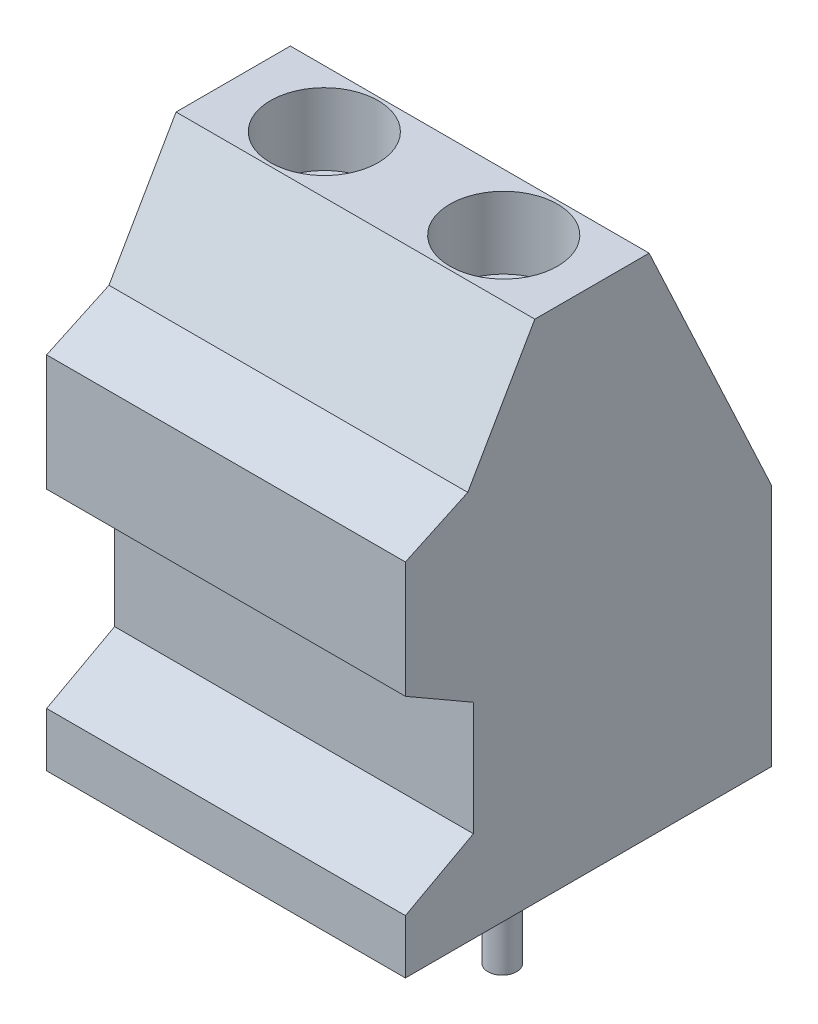
ISO-10303-21;
HEADER;
FILE_DESCRIPTION(('STEP AP214'),'2;1');
FILE_NAME('part.step','',(''),(''),'','','');
FILE_SCHEMA(('AUTOMOTIVE_DESIGN { 1 0 10303 214 1 1 1 1 }'));
ENDSEC;
DATA;
#1=APPLICATION_CONTEXT('core data for automotive mechanical design processes');
#2=APPLICATION_PROTOCOL_DEFINITION('international standard','automotive_design',2000,#1);
#3=PRODUCT_CONTEXT('',#1,'mechanical');
#4=PRODUCT('Part','Part','',(#3));
#5=PRODUCT_RELATED_PRODUCT_CATEGORY('part','',(#4));
#6=PRODUCT_DEFINITION_FORMATION('','',#4);
#7=PRODUCT_DEFINITION_CONTEXT('part definition',#1,'design');
#8=PRODUCT_DEFINITION('design','',#6,#7);
#9=PRODUCT_DEFINITION_SHAPE('','',#8);
#10=(LENGTH_UNIT() NAMED_UNIT(*) SI_UNIT(.MILLI.,.METRE.));
#11=(NAMED_UNIT(*) PLANE_ANGLE_UNIT() SI_UNIT($,.RADIAN.));
#12=(NAMED_UNIT(*) SI_UNIT($,.STERADIAN.) SOLID_ANGLE_UNIT());
#13=UNCERTAINTY_MEASURE_WITH_UNIT(LENGTH_MEASURE(1.E-05),#10,'distance_accuracy_value','');
#14=(GEOMETRIC_REPRESENTATION_CONTEXT(3) GLOBAL_UNCERTAINTY_ASSIGNED_CONTEXT((#13)) GLOBAL_UNIT_ASSIGNED_CONTEXT((#10,
#11,#12)) REPRESENTATION_CONTEXT('',''));
#15=CARTESIAN_POINT('',(0.,0.,0.));
#16=DIRECTION('',(0.,0.,1.));
#17=DIRECTION('',(1.,0.,0.));
#18=AXIS2_PLACEMENT_3D('',#15,#16,#17);
#19=CARTESIAN_POINT('',(10.,0.,0.));
#20=DIRECTION('',(0.,1.,0.));
#21=DIRECTION('',(0.,0.,1.));
#22=AXIS2_PLACEMENT_3D('',#19,#20,#21);
#23=PLANE('',#22);
#24=CARTESIAN_POINT('',(2.5,0.,0.));
#25=DIRECTION('',(0.,1.,0.));
#26=DIRECTION('',(0.,0.,1.));
#27=AXIS2_PLACEMENT_3D('',#24,#25,#26);
#28=CIRCLE('',#27,0.4);
#29=CARTESIAN_POINT('',(2.5,0.,0.4));
#30=VERTEX_POINT('',#29);
#31=EDGE_CURVE('E43',#30,#30,#28,.F.);
#32=ORIENTED_EDGE('',*,*,#31,.F.);
#33=EDGE_LOOP('',(#32));
#34=FACE_BOUND('',#33,.T.);
#35=DIRECTION('',(0.,0.,-1.));
#36=VECTOR('',#35,1.);
#37=CARTESIAN_POINT('',(0.,0.,0.));
#38=LINE('',#37,#36);
#39=CARTESIAN_POINT('',(0.,0.,5.2));
#40=VERTEX_POINT('',#39);
#41=CARTESIAN_POINT('',(0.,0.,-5.));
#42=VERTEX_POINT('',#41);
#43=EDGE_CURVE('E96',#40,#42,#38,.T.);
#44=ORIENTED_EDGE('',*,*,#43,.T.);
#45=DIRECTION('',(-1.,0.,0.));
#46=VECTOR('',#45,1.);
#47=CARTESIAN_POINT('',(10.,0.,-5.));
#48=LINE('',#47,#46);
#49=CARTESIAN_POINT('',(10.,0.,-5.));
#50=VERTEX_POINT('',#49);
#51=EDGE_CURVE('E191',#50,#42,#48,.T.);
#52=ORIENTED_EDGE('',*,*,#51,.F.);
#53=DIRECTION('',(0.,0.,-1.));
#54=VECTOR('',#53,1.);
#55=CARTESIAN_POINT('',(10.,0.,5.2));
#56=LINE('',#55,#54);
#57=CARTESIAN_POINT('',(10.,0.,5.2));
#58=VERTEX_POINT('',#57);
#59=EDGE_CURVE('E102',#58,#50,#56,.T.);
#60=ORIENTED_EDGE('',*,*,#59,.F.);
#61=DIRECTION('',(-1.,0.,0.));
#62=VECTOR('',#61,1.);
#63=CARTESIAN_POINT('',(10.,0.,5.2));
#64=LINE('',#63,#62);
#65=EDGE_CURVE('E145',#58,#40,#64,.T.);
#66=ORIENTED_EDGE('',*,*,#65,.T.);
#67=EDGE_LOOP('',(#44,#52,#60,#66));
#68=FACE_BOUND('',#67,.T.);
#69=CARTESIAN_POINT('',(7.5,0.,0.));
#70=DIRECTION('',(0.,1.,0.));
#71=DIRECTION('',(0.,0.,1.));
#72=AXIS2_PLACEMENT_3D('',#69,#70,#71);
#73=CIRCLE('',#72,0.400000000000001);
#74=CARTESIAN_POINT('',(7.5,0.,0.400000000000001));
#75=VERTEX_POINT('',#74);
#76=EDGE_CURVE('E11',#75,#75,#73,.F.);
#77=ORIENTED_EDGE('',*,*,#76,.F.);
#78=EDGE_LOOP('',(#77));
#79=FACE_BOUND('',#78,.T.);
#80=ADVANCED_FACE('F35',(#34,#68,#79),#23,.F.);
#81=CARTESIAN_POINT('',(10.,0.,-5.));
#82=DIRECTION('',(0.,0.,1.));
#83=DIRECTION('',(1.,0.,0.));
#84=AXIS2_PLACEMENT_3D('',#81,#82,#83);
#85=PLANE('',#84);
#86=DIRECTION('',(0.,1.,0.));
#87=VECTOR('',#86,1.);
#88=CARTESIAN_POINT('',(0.,0.,-5.));
#89=LINE('',#88,#87);
#90=CARTESIAN_POINT('',(0.,6.79894944949612,-5.));
#91=VERTEX_POINT('',#90);
#92=EDGE_CURVE('E150',#42,#91,#89,.T.);
#93=ORIENTED_EDGE('',*,*,#92,.T.);
#94=DIRECTION('',(-1.,0.,0.));
#95=VECTOR('',#94,1.);
#96=CARTESIAN_POINT('',(10.,6.79894944949612,-5.));
#97=LINE('',#96,#95);
#98=CARTESIAN_POINT('',(10.,6.79894944949612,-5.));
#99=VERTEX_POINT('',#98);
#100=EDGE_CURVE('E188',#99,#91,#97,.T.);
#101=ORIENTED_EDGE('',*,*,#100,.F.);
#102=DIRECTION('',(0.,1.,0.));
#103=VECTOR('',#102,1.);
#104=CARTESIAN_POINT('',(10.,0.,-5.));
#105=LINE('',#104,#103);
#106=EDGE_CURVE('E308',#50,#99,#105,.T.);
#107=ORIENTED_EDGE('',*,*,#106,.F.);
#108=ORIENTED_EDGE('',*,*,#51,.T.);
#109=EDGE_LOOP('',(#93,#101,#107,#108));
#110=FACE_BOUND('',#109,.T.);
#111=ADVANCED_FACE('F200',(#110),#85,.F.);
#112=CARTESIAN_POINT('',(10.,6.79894944949612,-5.));
#113=DIRECTION('',(0.,-0.422883614580425,0.906184003676624));
#114=DIRECTION('',(0.,-0.906184003676624,-0.422883614580425));
#115=AXIS2_PLACEMENT_3D('',#112,#113,#114);
#116=PLANE('',#115);
#117=DIRECTION('',(0.,0.906184003676624,0.422883614580425));
#118=VECTOR('',#117,1.);
#119=CARTESIAN_POINT('',(0.,6.79894944949612,-5.));
#120=LINE('',#119,#118);
#121=CARTESIAN_POINT('',(0.,14.1,-1.59286123513027));
#122=VERTEX_POINT('',#121);
#123=EDGE_CURVE('E153',#91,#122,#120,.T.);
#124=ORIENTED_EDGE('',*,*,#123,.T.);
#125=DIRECTION('',(-1.,0.,0.));
#126=VECTOR('',#125,1.);
#127=CARTESIAN_POINT('',(10.,14.1,-1.59286123513027));
#128=LINE('',#127,#126);
#129=CARTESIAN_POINT('',(10.,14.1,-1.59286123513027));
#130=VERTEX_POINT('',#129);
#131=EDGE_CURVE('E185',#130,#122,#128,.T.);
#132=ORIENTED_EDGE('',*,*,#131,.F.);
#133=DIRECTION('',(0.,0.906184003676624,0.422883614580425));
#134=VECTOR('',#133,1.);
#135=CARTESIAN_POINT('',(10.,6.79894944949612,-5.));
#136=LINE('',#135,#134);
#137=EDGE_CURVE('E284',#99,#130,#136,.T.);
#138=ORIENTED_EDGE('',*,*,#137,.F.);
#139=ORIENTED_EDGE('',*,*,#100,.T.);
#140=EDGE_LOOP('',(#124,#132,#138,#139));
#141=FACE_BOUND('',#140,.T.);
#142=ADVANCED_FACE('F271',(#141),#116,.F.);
#143=CARTESIAN_POINT('',(10.,14.1,-1.59286123513027));
#144=DIRECTION('',(0.,-1.,0.));
#145=DIRECTION('',(0.,0.,-1.));
#146=AXIS2_PLACEMENT_3D('',#143,#144,#145);
#147=PLANE('',#146);
#148=CARTESIAN_POINT('',(7.54,14.1,0.));
#149=DIRECTION('',(0.,1.,0.));
#150=DIRECTION('',(0.,0.,1.));
#151=AXIS2_PLACEMENT_3D('',#148,#149,#150);
#152=CIRCLE('',#151,1.5);
#153=CARTESIAN_POINT('',(7.54,14.1,1.5));
#154=VERTEX_POINT('',#153);
#155=EDGE_CURVE('E318',#154,#154,#152,.T.);
#156=ORIENTED_EDGE('',*,*,#155,.F.);
#157=EDGE_LOOP('',(#156));
#158=FACE_BOUND('',#157,.T.);
#159=CARTESIAN_POINT('',(2.54,14.1,0.));
#160=DIRECTION('',(0.,1.,0.));
#161=DIRECTION('',(0.,0.,1.));
#162=AXIS2_PLACEMENT_3D('',#159,#160,#161);
#163=CIRCLE('',#162,1.5);
#164=CARTESIAN_POINT('',(2.54,14.1,1.5));
#165=VERTEX_POINT('',#164);
#166=EDGE_CURVE('E312',#165,#165,#163,.T.);
#167=ORIENTED_EDGE('',*,*,#166,.F.);
#168=EDGE_LOOP('',(#167));
#169=FACE_BOUND('',#168,.T.);
#170=DIRECTION('',(0.,0.,1.));
#171=VECTOR('',#170,1.);
#172=CARTESIAN_POINT('',(0.,14.1,-1.59286123513027));
#173=LINE('',#172,#171);
#174=CARTESIAN_POINT('',(0.,14.1,1.59286123513027));
#175=VERTEX_POINT('',#174);
#176=EDGE_CURVE('E155',#122,#175,#173,.T.);
#177=ORIENTED_EDGE('',*,*,#176,.T.);
#178=DIRECTION('',(-1.,0.,0.));
#179=VECTOR('',#178,1.);
#180=CARTESIAN_POINT('',(10.,14.1,1.59286123513027));
#181=LINE('',#180,#179);
#182=CARTESIAN_POINT('',(10.,14.1,1.59286123513027));
#183=VERTEX_POINT('',#182);
#184=EDGE_CURVE('E182',#183,#175,#181,.T.);
#185=ORIENTED_EDGE('',*,*,#184,.F.);
#186=DIRECTION('',(0.,0.,1.));
#187=VECTOR('',#186,1.);
#188=CARTESIAN_POINT('',(10.,14.1,-1.59286123513027));
#189=LINE('',#188,#187);
#190=EDGE_CURVE('E296',#130,#183,#189,.T.);
#191=ORIENTED_EDGE('',*,*,#190,.F.);
#192=ORIENTED_EDGE('',*,*,#131,.T.);
#193=EDGE_LOOP('',(#177,#185,#191,#192));
#194=FACE_BOUND('',#193,.T.);
#195=ADVANCED_FACE('F267',(#158,#169,#194),#147,.F.);
#196=CARTESIAN_POINT('',(10.,14.1,1.59286123513027));
#197=DIRECTION('',(0.,-0.498918007755061,-0.866649191736611));
#198=DIRECTION('',(0.,0.866649191736611,-0.498918007755061));
#199=AXIS2_PLACEMENT_3D('',#196,#197,#198);
#200=PLANE('',#199);
#201=DIRECTION('',(0.,-0.866649191736611,0.498918007755061));
#202=VECTOR('',#201,1.);
#203=CARTESIAN_POINT('',(0.,14.1,1.59286123513027));
#204=LINE('',#203,#202);
#205=CARTESIAN_POINT('',(0.,10.8527703520918,3.46224663594181));
#206=VERTEX_POINT('',#205);
#207=EDGE_CURVE('E157',#175,#206,#204,.T.);
#208=ORIENTED_EDGE('',*,*,#207,.T.);
#209=DIRECTION('',(-1.,0.,0.));
#210=VECTOR('',#209,1.);
#211=CARTESIAN_POINT('',(10.,10.8527703520918,3.46224663594181));
#212=LINE('',#211,#210);
#213=CARTESIAN_POINT('',(10.,10.8527703520918,3.46224663594181));
#214=VERTEX_POINT('',#213);
#215=EDGE_CURVE('E179',#214,#206,#212,.T.);
#216=ORIENTED_EDGE('',*,*,#215,.F.);
#217=DIRECTION('',(0.,-0.866649191736611,0.498918007755061));
#218=VECTOR('',#217,1.);
#219=CARTESIAN_POINT('',(10.,14.1,1.59286123513027));
#220=LINE('',#219,#218);
#221=EDGE_CURVE('E293',#183,#214,#220,.T.);
#222=ORIENTED_EDGE('',*,*,#221,.F.);
#223=ORIENTED_EDGE('',*,*,#184,.T.);
#224=EDGE_LOOP('',(#208,#216,#222,#223));
#225=FACE_BOUND('',#224,.T.);
#226=ADVANCED_FACE('F263',(#225),#200,.F.);
#227=CARTESIAN_POINT('',(10.,10.8527703520918,3.46224663594181));
#228=DIRECTION('',(0.,-0.906184003676623,-0.422883614580426));
#229=DIRECTION('',(0.,0.422883614580426,-0.906184003676623));
#230=AXIS2_PLACEMENT_3D('',#227,#228,#229);
#231=PLANE('',#230);
#232=DIRECTION('',(0.,-0.422883614580426,0.906184003676623));
#233=VECTOR('',#232,1.);
#234=CARTESIAN_POINT('',(0.,10.8527703520918,3.46224663594181));
#235=LINE('',#234,#233);
#236=CARTESIAN_POINT('',(0.,10.0418231042252,5.2));
#237=VERTEX_POINT('',#236);
#238=EDGE_CURVE('E159',#206,#237,#235,.T.);
#239=ORIENTED_EDGE('',*,*,#238,.T.);
#240=DIRECTION('',(-1.,0.,0.));
#241=VECTOR('',#240,1.);
#242=CARTESIAN_POINT('',(10.,10.0418231042252,5.2));
#243=LINE('',#242,#241);
#244=CARTESIAN_POINT('',(10.,10.0418231042252,5.2));
#245=VERTEX_POINT('',#244);
#246=EDGE_CURVE('E176',#245,#237,#243,.T.);
#247=ORIENTED_EDGE('',*,*,#246,.F.);
#248=DIRECTION('',(0.,-0.422883614580426,0.906184003676623));
#249=VECTOR('',#248,1.);
#250=CARTESIAN_POINT('',(10.,10.8527703520918,3.46224663594181));
#251=LINE('',#250,#249);
#252=EDGE_CURVE('E295',#214,#245,#251,.T.);
#253=ORIENTED_EDGE('',*,*,#252,.F.);
#254=ORIENTED_EDGE('',*,*,#215,.T.);
#255=EDGE_LOOP('',(#239,#247,#253,#254));
#256=FACE_BOUND('',#255,.T.);
#257=ADVANCED_FACE('F259',(#256),#231,.F.);
#258=CARTESIAN_POINT('',(10.,10.0418231042252,5.2));
#259=DIRECTION('',(0.,0.,-1.));
#260=DIRECTION('',(-1.,0.,0.));
#261=AXIS2_PLACEMENT_3D('',#258,#259,#260);
#262=PLANE('',#261);
#263=DIRECTION('',(0.,-1.,0.));
#264=VECTOR('',#263,1.);
#265=CARTESIAN_POINT('',(0.,10.0418231042252,5.2));
#266=LINE('',#265,#264);
#267=CARTESIAN_POINT('',(0.,6.79894944949612,5.2));
#268=VERTEX_POINT('',#267);
#269=EDGE_CURVE('E161',#237,#268,#266,.T.);
#270=ORIENTED_EDGE('',*,*,#269,.T.);
#271=DIRECTION('',(-1.,0.,0.));
#272=VECTOR('',#271,1.);
#273=CARTESIAN_POINT('',(10.,6.79894944949612,5.2));
#274=LINE('',#273,#272);
#275=CARTESIAN_POINT('',(10.,6.79894944949612,5.2));
#276=VERTEX_POINT('',#275);
#277=EDGE_CURVE('E173',#276,#268,#274,.T.);
#278=ORIENTED_EDGE('',*,*,#277,.F.);
#279=DIRECTION('',(0.,-1.,0.));
#280=VECTOR('',#279,1.);
#281=CARTESIAN_POINT('',(10.,10.0418231042252,5.2));
#282=LINE('',#281,#280);
#283=EDGE_CURVE('E298',#245,#276,#282,.T.);
#284=ORIENTED_EDGE('',*,*,#283,.F.);
#285=ORIENTED_EDGE('',*,*,#246,.T.);
#286=EDGE_LOOP('',(#270,#278,#284,#285));
#287=FACE_BOUND('',#286,.T.);
#288=ADVANCED_FACE('F255',(#287),#262,.F.);
#289=CARTESIAN_POINT('',(10.,6.79894944949612,5.2));
#290=DIRECTION('',(0.,0.866649191736611,-0.498918007755061));
#291=DIRECTION('',(0.,0.498918007755061,0.866649191736611));
#292=AXIS2_PLACEMENT_3D('',#289,#290,#291);
#293=PLANE('',#292);
#294=DIRECTION('',(0.,-0.498918007755061,-0.866649191736611));
#295=VECTOR('',#294,1.);
#296=CARTESIAN_POINT('',(0.,6.79894944949612,5.2));
#297=LINE('',#296,#295);
#298=CARTESIAN_POINT('',(0.,5.70850020788453,3.30582713154656));
#299=VERTEX_POINT('',#298);
#300=EDGE_CURVE('E163',#268,#299,#297,.T.);
#301=ORIENTED_EDGE('',*,*,#300,.T.);
#302=DIRECTION('',(-1.,0.,0.));
#303=VECTOR('',#302,1.);
#304=CARTESIAN_POINT('',(10.,5.70850020788453,3.30582713154656));
#305=LINE('',#304,#303);
#306=CARTESIAN_POINT('',(10.,5.70850020788453,3.30582713154656));
#307=VERTEX_POINT('',#306);
#308=EDGE_CURVE('E140',#307,#299,#305,.T.);
#309=ORIENTED_EDGE('',*,*,#308,.F.);
#310=DIRECTION('',(0.,-0.498918007755061,-0.866649191736611));
#311=VECTOR('',#310,1.);
#312=CARTESIAN_POINT('',(10.,6.79894944949612,5.2));
#313=LINE('',#312,#311);
#314=EDGE_CURVE('E131',#276,#307,#313,.T.);
#315=ORIENTED_EDGE('',*,*,#314,.F.);
#316=ORIENTED_EDGE('',*,*,#277,.T.);
#317=EDGE_LOOP('',(#301,#309,#315,#316));
#318=FACE_BOUND('',#317,.T.);
#319=ADVANCED_FACE('F252',(#318),#293,.F.);
#320=CARTESIAN_POINT('',(10.,5.70850020788453,3.30582713154656));
#321=DIRECTION('',(0.,0.,-1.));
#322=DIRECTION('',(-1.,0.,0.));
#323=AXIS2_PLACEMENT_3D('',#320,#321,#322);
#324=PLANE('',#323);
#325=DIRECTION('',(0.,-1.,0.));
#326=VECTOR('',#325,1.);
#327=CARTESIAN_POINT('',(0.,5.70850020788453,3.30582713154656));
#328=LINE('',#327,#326);
#329=CARTESIAN_POINT('',(0.,2.53459412510442,3.30582713154656));
#330=VERTEX_POINT('',#329);
#331=EDGE_CURVE('E139',#299,#330,#328,.T.);
#332=ORIENTED_EDGE('',*,*,#331,.T.);
#333=DIRECTION('',(-1.,0.,0.));
#334=VECTOR('',#333,1.);
#335=CARTESIAN_POINT('',(10.,2.53459412510442,3.30582713154656));
#336=LINE('',#335,#334);
#337=CARTESIAN_POINT('',(10.,2.53459412510442,3.30582713154656));
#338=VERTEX_POINT('',#337);
#339=EDGE_CURVE('E136',#338,#330,#336,.T.);
#340=ORIENTED_EDGE('',*,*,#339,.F.);
#341=DIRECTION('',(0.,-1.,0.));
#342=VECTOR('',#341,1.);
#343=CARTESIAN_POINT('',(10.,5.70850020788453,3.30582713154656));
#344=LINE('',#343,#342);
#345=EDGE_CURVE('E125',#307,#338,#344,.T.);
#346=ORIENTED_EDGE('',*,*,#345,.F.);
#347=ORIENTED_EDGE('',*,*,#308,.T.);
#348=EDGE_LOOP('',(#332,#340,#346,#347));
#349=FACE_BOUND('',#348,.T.);
#350=ADVANCED_FACE('F137',(#349),#324,.F.);
#351=CARTESIAN_POINT('',(10.,2.53459412510442,3.30582713154656));
#352=DIRECTION('',(0.,-0.878817245668949,-0.477158515291137));
#353=DIRECTION('',(0.,0.477158515291137,-0.878817245668949));
#354=AXIS2_PLACEMENT_3D('',#351,#352,#353);
#355=PLANE('',#354);
#356=DIRECTION('',(0.,-0.477158515291137,0.878817245668949));
#357=VECTOR('',#356,1.);
#358=CARTESIAN_POINT('',(0.,2.53459412510442,3.30582713154656));
#359=LINE('',#358,#357);
#360=CARTESIAN_POINT('',(0.,1.50614285372773,5.2));
#361=VERTEX_POINT('',#360);
#362=EDGE_CURVE('E89',#330,#361,#359,.T.);
#363=ORIENTED_EDGE('',*,*,#362,.T.);
#364=DIRECTION('',(-1.,0.,0.));
#365=VECTOR('',#364,1.);
#366=CARTESIAN_POINT('',(10.,1.50614285372773,5.2));
#367=LINE('',#366,#365);
#368=CARTESIAN_POINT('',(10.,1.50614285372773,5.2));
#369=VERTEX_POINT('',#368);
#370=EDGE_CURVE('E141',#369,#361,#367,.T.);
#371=ORIENTED_EDGE('',*,*,#370,.F.);
#372=DIRECTION('',(0.,-0.477158515291137,0.878817245668949));
#373=VECTOR('',#372,1.);
#374=CARTESIAN_POINT('',(10.,2.53459412510442,3.30582713154656));
#375=LINE('',#374,#373);
#376=EDGE_CURVE('E129',#338,#369,#375,.T.);
#377=ORIENTED_EDGE('',*,*,#376,.F.);
#378=ORIENTED_EDGE('',*,*,#339,.T.);
#379=EDGE_LOOP('',(#363,#371,#377,#378));
#380=FACE_BOUND('',#379,.T.);
#381=ADVANCED_FACE('F143',(#380),#355,.F.);
#382=CARTESIAN_POINT('',(10.,1.50614285372773,5.2));
#383=DIRECTION('',(0.,0.,-1.));
#384=DIRECTION('',(-1.,0.,0.));
#385=AXIS2_PLACEMENT_3D('',#382,#383,#384);
#386=PLANE('',#385);
#387=DIRECTION('',(0.,-1.,0.));
#388=VECTOR('',#387,1.);
#389=CARTESIAN_POINT('',(0.,1.50614285372773,5.2));
#390=LINE('',#389,#388);
#391=EDGE_CURVE('E167',#361,#40,#390,.T.);
#392=ORIENTED_EDGE('',*,*,#391,.T.);
#393=ORIENTED_EDGE('',*,*,#65,.F.);
#394=DIRECTION('',(0.,-1.,0.));
#395=VECTOR('',#394,1.);
#396=CARTESIAN_POINT('',(10.,1.50614285372773,5.2));
#397=LINE('',#396,#395);
#398=EDGE_CURVE('E51',#369,#58,#397,.T.);
#399=ORIENTED_EDGE('',*,*,#398,.F.);
#400=ORIENTED_EDGE('',*,*,#370,.T.);
#401=EDGE_LOOP('',(#392,#393,#399,#400));
#402=FACE_BOUND('',#401,.T.);
#403=ADVANCED_FACE('F242',(#402),#386,.F.);
#404=CARTESIAN_POINT('',(10.,0.,0.));
#405=DIRECTION('',(1.,0.,0.));
#406=DIRECTION('',(0.,0.,-1.));
#407=AXIS2_PLACEMENT_3D('',#404,#405,#406);
#408=PLANE('',#407);
#409=ORIENTED_EDGE('',*,*,#59,.T.);
#410=ORIENTED_EDGE('',*,*,#106,.T.);
#411=ORIENTED_EDGE('',*,*,#137,.T.);
#412=ORIENTED_EDGE('',*,*,#190,.T.);
#413=ORIENTED_EDGE('',*,*,#221,.T.);
#414=ORIENTED_EDGE('',*,*,#252,.T.);
#415=ORIENTED_EDGE('',*,*,#283,.T.);
#416=ORIENTED_EDGE('',*,*,#314,.T.);
#417=ORIENTED_EDGE('',*,*,#345,.T.);
#418=ORIENTED_EDGE('',*,*,#376,.T.);
#419=ORIENTED_EDGE('',*,*,#398,.T.);
#420=EDGE_LOOP('',(#409,#410,#411,#412,#413,#414,#415,#416,#417,#418,#419));
#421=FACE_BOUND('',#420,.T.);
#422=ADVANCED_FACE('F127',(#421),#408,.T.);
#423=CARTESIAN_POINT('',(0.,0.,0.));
#424=DIRECTION('',(1.,0.,0.));
#425=DIRECTION('',(0.,0.,-1.));
#426=AXIS2_PLACEMENT_3D('',#423,#424,#425);
#427=PLANE('',#426);
#428=ORIENTED_EDGE('',*,*,#43,.F.);
#429=ORIENTED_EDGE('',*,*,#391,.F.);
#430=ORIENTED_EDGE('',*,*,#362,.F.);
#431=ORIENTED_EDGE('',*,*,#331,.F.);
#432=ORIENTED_EDGE('',*,*,#300,.F.);
#433=ORIENTED_EDGE('',*,*,#269,.F.);
#434=ORIENTED_EDGE('',*,*,#238,.F.);
#435=ORIENTED_EDGE('',*,*,#207,.F.);
#436=ORIENTED_EDGE('',*,*,#176,.F.);
#437=ORIENTED_EDGE('',*,*,#123,.F.);
#438=ORIENTED_EDGE('',*,*,#92,.F.);
#439=EDGE_LOOP('',(#428,#429,#430,#431,#432,#433,#434,#435,#436,#437,#438));
#440=FACE_BOUND('',#439,.T.);
#441=ADVANCED_FACE('F238',(#440),#427,.F.);
#442=CARTESIAN_POINT('',(2.54,12.1,0.));
#443=DIRECTION('',(0.,1.,0.));
#444=DIRECTION('',(0.,0.,1.));
#445=AXIS2_PLACEMENT_3D('',#442,#443,#444);
#446=CYLINDRICAL_SURFACE('',#445,1.5);
#447=CARTESIAN_POINT('',(2.54,12.1,0.));
#448=DIRECTION('',(0.,1.,0.));
#449=DIRECTION('',(0.,0.,1.));
#450=AXIS2_PLACEMENT_3D('',#447,#448,#449);
#451=CIRCLE('',#450,1.5);
#452=CARTESIAN_POINT('',(2.54,12.1,1.5));
#453=VERTEX_POINT('',#452);
#454=EDGE_CURVE('E151',#453,#453,#451,.T.);
#455=ORIENTED_EDGE('',*,*,#454,.F.);
#456=EDGE_LOOP('',(#455));
#457=FACE_BOUND('',#456,.T.);
#458=ORIENTED_EDGE('',*,*,#166,.T.);
#459=EDGE_LOOP('',(#458));
#460=FACE_BOUND('',#459,.T.);
#461=ADVANCED_FACE('F234',(#457,#460),#446,.F.);
#462=CARTESIAN_POINT('',(2.54,12.1,0.));
#463=DIRECTION('',(0.,1.,0.));
#464=DIRECTION('',(0.,0.,1.));
#465=AXIS2_PLACEMENT_3D('',#462,#463,#464);
#466=PLANE('',#465);
#467=ORIENTED_EDGE('',*,*,#454,.T.);
#468=EDGE_LOOP('',(#467));
#469=FACE_BOUND('',#468,.T.);
#470=ADVANCED_FACE('F230',(#469),#466,.T.);
#471=CARTESIAN_POINT('',(7.54,12.1,0.));
#472=DIRECTION('',(0.,1.,0.));
#473=DIRECTION('',(0.,0.,1.));
#474=AXIS2_PLACEMENT_3D('',#471,#472,#473);
#475=CYLINDRICAL_SURFACE('',#474,1.5);
#476=CARTESIAN_POINT('',(7.54,12.1,0.));
#477=DIRECTION('',(0.,1.,0.));
#478=DIRECTION('',(0.,0.,1.));
#479=AXIS2_PLACEMENT_3D('',#476,#477,#478);
#480=CIRCLE('',#479,1.5);
#481=CARTESIAN_POINT('',(7.54,12.1,1.5));
#482=VERTEX_POINT('',#481);
#483=EDGE_CURVE('E315',#482,#482,#480,.T.);
#484=ORIENTED_EDGE('',*,*,#483,.F.);
#485=EDGE_LOOP('',(#484));
#486=FACE_BOUND('',#485,.T.);
#487=ORIENTED_EDGE('',*,*,#155,.T.);
#488=EDGE_LOOP('',(#487));
#489=FACE_BOUND('',#488,.T.);
#490=ADVANCED_FACE('F226',(#486,#489),#475,.F.);
#491=CARTESIAN_POINT('',(7.54,12.1,0.));
#492=DIRECTION('',(0.,1.,0.));
#493=DIRECTION('',(0.,0.,1.));
#494=AXIS2_PLACEMENT_3D('',#491,#492,#493);
#495=PLANE('',#494);
#496=ORIENTED_EDGE('',*,*,#483,.T.);
#497=EDGE_LOOP('',(#496));
#498=FACE_BOUND('',#497,.T.);
#499=ADVANCED_FACE('F222',(#498),#495,.T.);
#500=CARTESIAN_POINT('',(2.5,-3.5,0.));
#501=DIRECTION('',(0.,1.,0.));
#502=DIRECTION('',(0.,0.,1.));
#503=AXIS2_PLACEMENT_3D('',#500,#501,#502);
#504=CYLINDRICAL_SURFACE('',#503,0.4);
#505=CARTESIAN_POINT('',(2.5,-3.5,0.));
#506=DIRECTION('',(0.,-1.,0.));
#507=DIRECTION('',(0.,0.,-1.));
#508=AXIS2_PLACEMENT_3D('',#505,#506,#507);
#509=CIRCLE('',#508,0.4);
#510=CARTESIAN_POINT('',(2.5,-3.5,-0.4));
#511=VERTEX_POINT('',#510);
#512=EDGE_CURVE('E321',#511,#511,#509,.T.);
#513=ORIENTED_EDGE('',*,*,#512,.F.);
#514=EDGE_LOOP('',(#513));
#515=FACE_BOUND('',#514,.T.);
#516=ORIENTED_EDGE('',*,*,#31,.T.);
#517=EDGE_LOOP('',(#516));
#518=FACE_BOUND('',#517,.T.);
#519=ADVANCED_FACE('F196',(#515,#518),#504,.T.);
#520=CARTESIAN_POINT('',(2.5,-3.5,0.));
#521=DIRECTION('',(0.,-1.,0.));
#522=DIRECTION('',(0.,0.,-1.));
#523=AXIS2_PLACEMENT_3D('',#520,#521,#522);
#524=PLANE('',#523);
#525=ORIENTED_EDGE('',*,*,#512,.T.);
#526=EDGE_LOOP('',(#525));
#527=FACE_BOUND('',#526,.T.);
#528=ADVANCED_FACE('F207',(#527),#524,.T.);
#529=CARTESIAN_POINT('',(7.5,-3.5,0.));
#530=DIRECTION('',(0.,1.,0.));
#531=DIRECTION('',(0.,0.,1.));
#532=AXIS2_PLACEMENT_3D('',#529,#530,#531);
#533=CYLINDRICAL_SURFACE('',#532,0.400000000000001);
#534=CARTESIAN_POINT('',(7.5,-3.5,0.));
#535=DIRECTION('',(0.,-1.,0.));
#536=DIRECTION('',(0.,0.,-1.));
#537=AXIS2_PLACEMENT_3D('',#534,#535,#536);
#538=CIRCLE('',#537,0.400000000000001);
#539=CARTESIAN_POINT('',(7.5,-3.5,-0.400000000000001));
#540=VERTEX_POINT('',#539);
#541=EDGE_CURVE('E326',#540,#540,#538,.T.);
#542=ORIENTED_EDGE('',*,*,#541,.F.);
#543=EDGE_LOOP('',(#542));
#544=FACE_BOUND('',#543,.T.);
#545=ORIENTED_EDGE('',*,*,#76,.T.);
#546=EDGE_LOOP('',(#545));
#547=FACE_BOUND('',#546,.T.);
#548=ADVANCED_FACE('F204',(#544,#547),#533,.T.);
#549=CARTESIAN_POINT('',(7.5,-3.5,0.));
#550=DIRECTION('',(0.,-1.,0.));
#551=DIRECTION('',(0.,0.,-1.));
#552=AXIS2_PLACEMENT_3D('',#549,#550,#551);
#553=PLANE('',#552);
#554=ORIENTED_EDGE('',*,*,#541,.T.);
#555=EDGE_LOOP('',(#554));
#556=FACE_BOUND('',#555,.T.);
#557=ADVANCED_FACE('F206',(#556),#553,.T.);
#558=CLOSED_SHELL('',(#80,#111,#142,#195,#226,#257,#288,#319,#350,#381,#403,#422,#441,#461,#470,
#490,#499,#519,#528,#548,#557));
#559=MANIFOLD_SOLID_BREP('B2',#558);
#560=ADVANCED_BREP_SHAPE_REPRESENTATION('',(#18,#559),#14);
#561=SHAPE_DEFINITION_REPRESENTATION(#9,#560);
ENDSEC;
END-ISO-10303-21;
